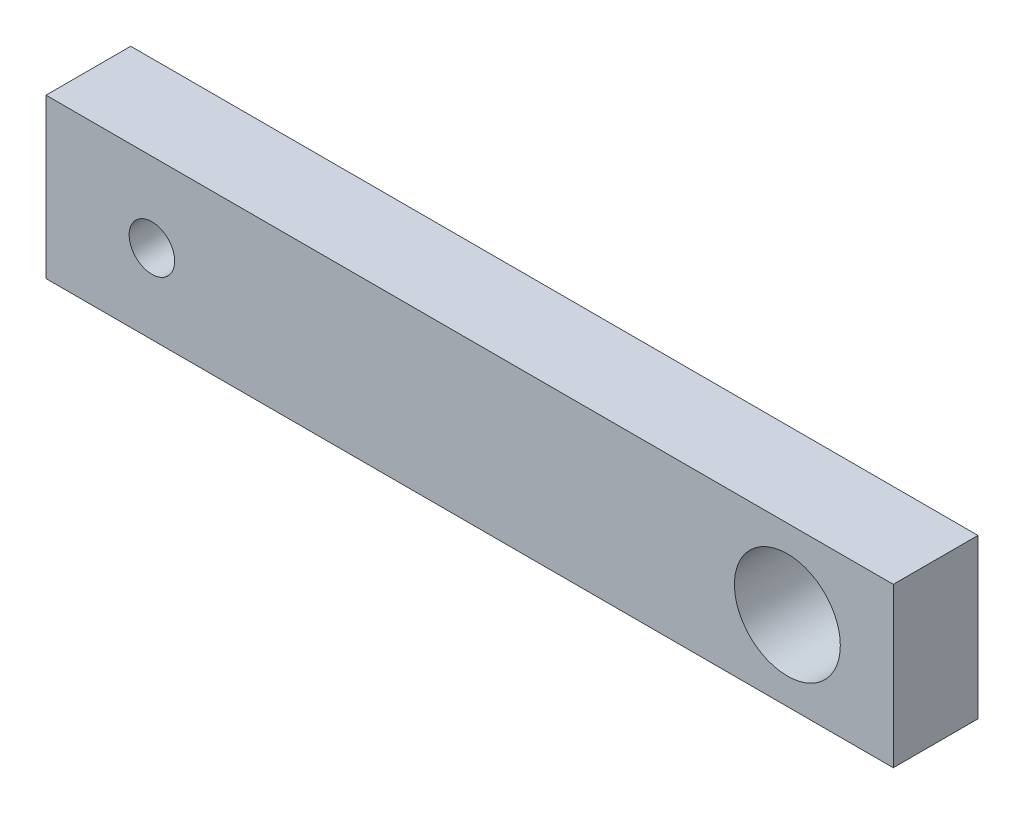
ISO-10303-21;
HEADER;
FILE_DESCRIPTION(('STEP AP214'),'2;1');
FILE_NAME('part.step','',(''),(''),'','','');
FILE_SCHEMA(('AUTOMOTIVE_DESIGN { 1 0 10303 214 1 1 1 1 }'));
ENDSEC;
DATA;
#1=APPLICATION_CONTEXT('core data for automotive mechanical design processes');
#2=APPLICATION_PROTOCOL_DEFINITION('international standard','automotive_design',2000,#1);
#3=PRODUCT_CONTEXT('',#1,'mechanical');
#4=PRODUCT('Part','Part','',(#3));
#5=PRODUCT_RELATED_PRODUCT_CATEGORY('part','',(#4));
#6=PRODUCT_DEFINITION_FORMATION('','',#4);
#7=PRODUCT_DEFINITION_CONTEXT('part definition',#1,'design');
#8=PRODUCT_DEFINITION('design','',#6,#7);
#9=PRODUCT_DEFINITION_SHAPE('','',#8);
#10=(LENGTH_UNIT() NAMED_UNIT(*) SI_UNIT(.MILLI.,.METRE.));
#11=(NAMED_UNIT(*) PLANE_ANGLE_UNIT() SI_UNIT($,.RADIAN.));
#12=(NAMED_UNIT(*) SI_UNIT($,.STERADIAN.) SOLID_ANGLE_UNIT());
#13=UNCERTAINTY_MEASURE_WITH_UNIT(LENGTH_MEASURE(1.E-05),#10,'distance_accuracy_value','');
#14=(GEOMETRIC_REPRESENTATION_CONTEXT(3) GLOBAL_UNCERTAINTY_ASSIGNED_CONTEXT((#13)) GLOBAL_UNIT_ASSIGNED_CONTEXT((#10,
#11,#12)) REPRESENTATION_CONTEXT('',''));
#15=CARTESIAN_POINT('',(0.,0.,0.));
#16=DIRECTION('',(0.,0.,1.));
#17=DIRECTION('',(1.,0.,0.));
#18=AXIS2_PLACEMENT_3D('',#15,#16,#17);
#19=CARTESIAN_POINT('',(0.,0.,8.));
#20=DIRECTION('',(0.,0.,1.));
#21=DIRECTION('',(1.,0.,0.));
#22=AXIS2_PLACEMENT_3D('',#19,#20,#21);
#23=PLANE('',#22);
#24=CARTESIAN_POINT('',(10.,-7.5,8.));
#25=DIRECTION('',(0.,0.,1.));
#26=DIRECTION('',(1.,0.,0.));
#27=AXIS2_PLACEMENT_3D('',#24,#25,#26);
#28=CIRCLE('',#27,2.15);
#29=CARTESIAN_POINT('',(12.15,-7.5,8.));
#30=VERTEX_POINT('',#29);
#31=EDGE_CURVE('E100',#30,#30,#28,.T.);
#32=ORIENTED_EDGE('',*,*,#31,.F.);
#33=EDGE_LOOP('',(#32));
#34=FACE_BOUND('',#33,.T.);
#35=DIRECTION('',(0.,-1.,0.));
#36=VECTOR('',#35,1.);
#37=CARTESIAN_POINT('',(0.,0.,8.));
#38=LINE('',#37,#36);
#39=CARTESIAN_POINT('',(0.,0.,8.));
#40=VERTEX_POINT('',#39);
#41=CARTESIAN_POINT('',(0.,-15.,8.));
#42=VERTEX_POINT('',#41);
#43=EDGE_CURVE('E85',#40,#42,#38,.T.);
#44=ORIENTED_EDGE('',*,*,#43,.T.);
#45=DIRECTION('',(1.,0.,0.));
#46=VECTOR('',#45,1.);
#47=CARTESIAN_POINT('',(0.,-15.,8.));
#48=LINE('',#47,#46);
#49=CARTESIAN_POINT('',(80.,-15.,8.));
#50=VERTEX_POINT('',#49);
#51=EDGE_CURVE('E80',#42,#50,#48,.T.);
#52=ORIENTED_EDGE('',*,*,#51,.T.);
#53=DIRECTION('',(0.,1.,0.));
#54=VECTOR('',#53,1.);
#55=CARTESIAN_POINT('',(80.,0.,8.));
#56=LINE('',#55,#54);
#57=CARTESIAN_POINT('',(80.,0.,8.));
#58=VERTEX_POINT('',#57);
#59=EDGE_CURVE('E83',#50,#58,#56,.T.);
#60=ORIENTED_EDGE('',*,*,#59,.T.);
#61=DIRECTION('',(-1.,0.,0.));
#62=VECTOR('',#61,1.);
#63=CARTESIAN_POINT('',(0.,0.,8.));
#64=LINE('',#63,#62);
#65=EDGE_CURVE('E50',#58,#40,#64,.T.);
#66=ORIENTED_EDGE('',*,*,#65,.T.);
#67=EDGE_LOOP('',(#44,#52,#60,#66));
#68=FACE_BOUND('',#67,.T.);
#69=CARTESIAN_POINT('',(70.,-7.5,8.));
#70=DIRECTION('',(0.,0.,1.));
#71=DIRECTION('',(1.,0.,0.));
#72=AXIS2_PLACEMENT_3D('',#69,#70,#71);
#73=CIRCLE('',#72,5.);
#74=CARTESIAN_POINT('',(75.,-7.5,8.));
#75=VERTEX_POINT('',#74);
#76=EDGE_CURVE('E115',#75,#75,#73,.T.);
#77=ORIENTED_EDGE('',*,*,#76,.F.);
#78=EDGE_LOOP('',(#77));
#79=FACE_BOUND('',#78,.T.);
#80=ADVANCED_FACE('F33',(#34,#68,#79),#23,.T.);
#81=CARTESIAN_POINT('',(0.,0.,0.));
#82=DIRECTION('',(0.,0.,1.));
#83=DIRECTION('',(1.,0.,0.));
#84=AXIS2_PLACEMENT_3D('',#81,#82,#83);
#85=PLANE('',#84);
#86=DIRECTION('',(0.,-1.,0.));
#87=VECTOR('',#86,1.);
#88=CARTESIAN_POINT('',(0.,0.,0.));
#89=LINE('',#88,#87);
#90=CARTESIAN_POINT('',(0.,0.,0.));
#91=VERTEX_POINT('',#90);
#92=CARTESIAN_POINT('',(0.,-15.,0.));
#93=VERTEX_POINT('',#92);
#94=EDGE_CURVE('E97',#91,#93,#89,.T.);
#95=ORIENTED_EDGE('',*,*,#94,.F.);
#96=DIRECTION('',(-1.,0.,0.));
#97=VECTOR('',#96,1.);
#98=CARTESIAN_POINT('',(0.,0.,0.));
#99=LINE('',#98,#97);
#100=CARTESIAN_POINT('',(80.,0.,0.));
#101=VERTEX_POINT('',#100);
#102=EDGE_CURVE('E73',#101,#91,#99,.T.);
#103=ORIENTED_EDGE('',*,*,#102,.F.);
#104=DIRECTION('',(0.,1.,0.));
#105=VECTOR('',#104,1.);
#106=CARTESIAN_POINT('',(80.,0.,0.));
#107=LINE('',#106,#105);
#108=CARTESIAN_POINT('',(80.,-15.,0.));
#109=VERTEX_POINT('',#108);
#110=EDGE_CURVE('E67',#109,#101,#107,.T.);
#111=ORIENTED_EDGE('',*,*,#110,.F.);
#112=DIRECTION('',(1.,0.,0.));
#113=VECTOR('',#112,1.);
#114=CARTESIAN_POINT('',(0.,-15.,0.));
#115=LINE('',#114,#113);
#116=EDGE_CURVE('E89',#93,#109,#115,.T.);
#117=ORIENTED_EDGE('',*,*,#116,.F.);
#118=EDGE_LOOP('',(#95,#103,#111,#117));
#119=FACE_BOUND('',#118,.T.);
#120=CARTESIAN_POINT('',(10.,-7.5,0.));
#121=DIRECTION('',(0.,0.,1.));
#122=DIRECTION('',(1.,0.,0.));
#123=AXIS2_PLACEMENT_3D('',#120,#121,#122);
#124=CIRCLE('',#123,2.15);
#125=CARTESIAN_POINT('',(12.15,-7.5,0.));
#126=VERTEX_POINT('',#125);
#127=EDGE_CURVE('E112',#126,#126,#124,.T.);
#128=ORIENTED_EDGE('',*,*,#127,.T.);
#129=EDGE_LOOP('',(#128));
#130=FACE_BOUND('',#129,.T.);
#131=CARTESIAN_POINT('',(70.,-7.5,0.));
#132=DIRECTION('',(0.,0.,1.));
#133=DIRECTION('',(1.,0.,0.));
#134=AXIS2_PLACEMENT_3D('',#131,#132,#133);
#135=CIRCLE('',#134,5.);
#136=CARTESIAN_POINT('',(75.,-7.5,0.));
#137=VERTEX_POINT('',#136);
#138=EDGE_CURVE('E118',#137,#137,#135,.T.);
#139=ORIENTED_EDGE('',*,*,#138,.T.);
#140=EDGE_LOOP('',(#139));
#141=FACE_BOUND('',#140,.T.);
#142=ADVANCED_FACE('F108',(#119,#130,#141),#85,.F.);
#143=CARTESIAN_POINT('',(0.,0.,8.));
#144=DIRECTION('',(1.,0.,0.));
#145=DIRECTION('',(0.,1.,0.));
#146=AXIS2_PLACEMENT_3D('',#143,#144,#145);
#147=PLANE('',#146);
#148=ORIENTED_EDGE('',*,*,#94,.T.);
#149=DIRECTION('',(0.,0.,-1.));
#150=VECTOR('',#149,1.);
#151=CARTESIAN_POINT('',(0.,-15.,8.));
#152=LINE('',#151,#150);
#153=EDGE_CURVE('E11',#42,#93,#152,.T.);
#154=ORIENTED_EDGE('',*,*,#153,.F.);
#155=ORIENTED_EDGE('',*,*,#43,.F.);
#156=DIRECTION('',(0.,0.,-1.));
#157=VECTOR('',#156,1.);
#158=CARTESIAN_POINT('',(0.,0.,8.));
#159=LINE('',#158,#157);
#160=EDGE_CURVE('E93',#40,#91,#159,.T.);
#161=ORIENTED_EDGE('',*,*,#160,.T.);
#162=EDGE_LOOP('',(#148,#154,#155,#161));
#163=FACE_BOUND('',#162,.T.);
#164=ADVANCED_FACE('F35',(#163),#147,.F.);
#165=CARTESIAN_POINT('',(0.,-15.,8.));
#166=DIRECTION('',(0.,1.,0.));
#167=DIRECTION('',(0.,0.,1.));
#168=AXIS2_PLACEMENT_3D('',#165,#166,#167);
#169=PLANE('',#168);
#170=ORIENTED_EDGE('',*,*,#116,.T.);
#171=DIRECTION('',(0.,0.,-1.));
#172=VECTOR('',#171,1.);
#173=CARTESIAN_POINT('',(80.,-15.,8.));
#174=LINE('',#173,#172);
#175=EDGE_CURVE('E42',#50,#109,#174,.T.);
#176=ORIENTED_EDGE('',*,*,#175,.F.);
#177=ORIENTED_EDGE('',*,*,#51,.F.);
#178=ORIENTED_EDGE('',*,*,#153,.T.);
#179=EDGE_LOOP('',(#170,#176,#177,#178));
#180=FACE_BOUND('',#179,.T.);
#181=ADVANCED_FACE('F88',(#180),#169,.F.);
#182=CARTESIAN_POINT('',(80.,0.,8.));
#183=DIRECTION('',(-1.,0.,0.));
#184=DIRECTION('',(0.,0.,1.));
#185=AXIS2_PLACEMENT_3D('',#182,#183,#184);
#186=PLANE('',#185);
#187=ORIENTED_EDGE('',*,*,#110,.T.);
#188=DIRECTION('',(0.,0.,-1.));
#189=VECTOR('',#188,1.);
#190=CARTESIAN_POINT('',(80.,0.,8.));
#191=LINE('',#190,#189);
#192=EDGE_CURVE('E90',#58,#101,#191,.T.);
#193=ORIENTED_EDGE('',*,*,#192,.F.);
#194=ORIENTED_EDGE('',*,*,#59,.F.);
#195=ORIENTED_EDGE('',*,*,#175,.T.);
#196=EDGE_LOOP('',(#187,#193,#194,#195));
#197=FACE_BOUND('',#196,.T.);
#198=ADVANCED_FACE('F91',(#197),#186,.F.);
#199=CARTESIAN_POINT('',(0.,0.,8.));
#200=DIRECTION('',(0.,-1.,0.));
#201=DIRECTION('',(0.,0.,-1.));
#202=AXIS2_PLACEMENT_3D('',#199,#200,#201);
#203=PLANE('',#202);
#204=ORIENTED_EDGE('',*,*,#102,.T.);
#205=ORIENTED_EDGE('',*,*,#160,.F.);
#206=ORIENTED_EDGE('',*,*,#65,.F.);
#207=ORIENTED_EDGE('',*,*,#192,.T.);
#208=EDGE_LOOP('',(#204,#205,#206,#207));
#209=FACE_BOUND('',#208,.T.);
#210=ADVANCED_FACE('F105',(#209),#203,.F.);
#211=CARTESIAN_POINT('',(10.,-7.5,8.));
#212=DIRECTION('',(0.,0.,-1.));
#213=DIRECTION('',(-1.,0.,0.));
#214=AXIS2_PLACEMENT_3D('',#211,#212,#213);
#215=CYLINDRICAL_SURFACE('',#214,2.15);
#216=ORIENTED_EDGE('',*,*,#31,.T.);
#217=EDGE_LOOP('',(#216));
#218=FACE_BOUND('',#217,.T.);
#219=ORIENTED_EDGE('',*,*,#127,.F.);
#220=EDGE_LOOP('',(#219));
#221=FACE_BOUND('',#220,.T.);
#222=ADVANCED_FACE('F135',(#218,#221),#215,.F.);
#223=CARTESIAN_POINT('',(70.,-7.5,8.));
#224=DIRECTION('',(0.,0.,-1.));
#225=DIRECTION('',(-1.,0.,0.));
#226=AXIS2_PLACEMENT_3D('',#223,#224,#225);
#227=CYLINDRICAL_SURFACE('',#226,5.);
#228=ORIENTED_EDGE('',*,*,#76,.T.);
#229=EDGE_LOOP('',(#228));
#230=FACE_BOUND('',#229,.T.);
#231=ORIENTED_EDGE('',*,*,#138,.F.);
#232=EDGE_LOOP('',(#231));
#233=FACE_BOUND('',#232,.T.);
#234=ADVANCED_FACE('F124',(#230,#233),#227,.F.);
#235=CLOSED_SHELL('',(#80,#142,#164,#181,#198,#210,#222,#234));
#236=MANIFOLD_SOLID_BREP('B2',#235);
#237=ADVANCED_BREP_SHAPE_REPRESENTATION('',(#18,#236),#14);
#238=SHAPE_DEFINITION_REPRESENTATION(#9,#237);
ENDSEC;
END-ISO-10303-21;
